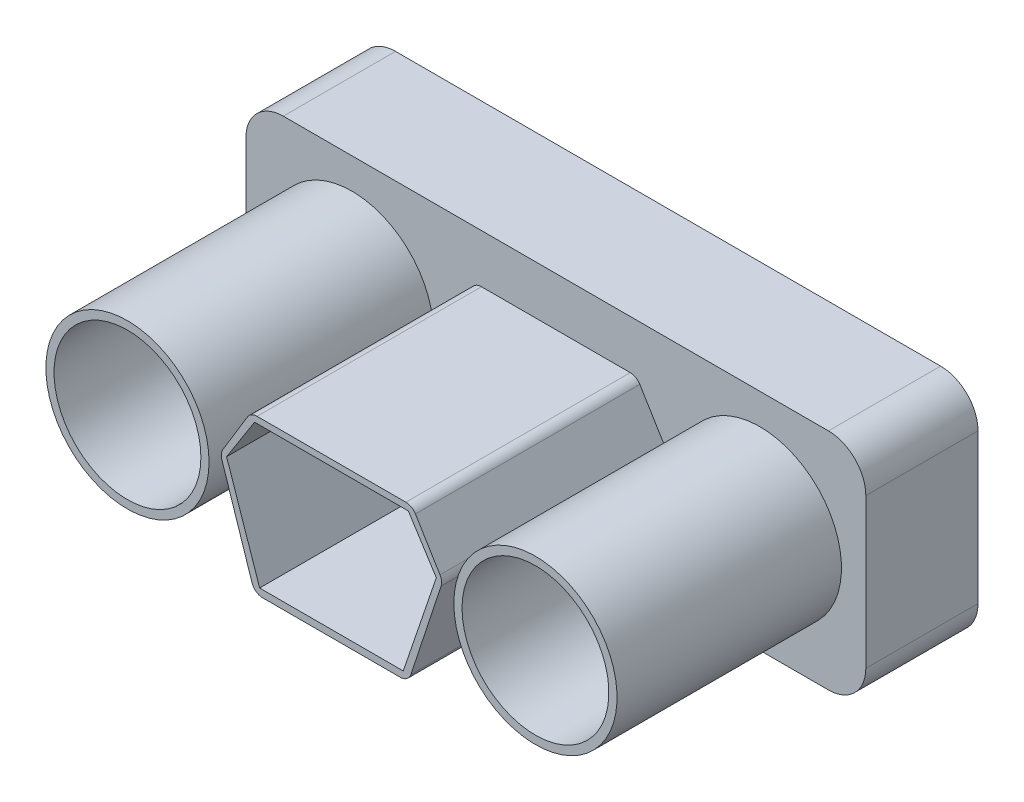
ISO-10303-21;
HEADER;
FILE_DESCRIPTION(('STEP AP214'),'2;1');
FILE_NAME('part.step','',(''),(''),'','','');
FILE_SCHEMA(('AUTOMOTIVE_DESIGN { 1 0 10303 214 1 1 1 1 }'));
ENDSEC;
DATA;
#1=APPLICATION_CONTEXT('core data for automotive mechanical design processes');
#2=APPLICATION_PROTOCOL_DEFINITION('international standard','automotive_design',2000,#1);
#3=PRODUCT_CONTEXT('',#1,'mechanical');
#4=PRODUCT('Part','Part','',(#3));
#5=PRODUCT_RELATED_PRODUCT_CATEGORY('part','',(#4));
#6=PRODUCT_DEFINITION_FORMATION('','',#4);
#7=PRODUCT_DEFINITION_CONTEXT('part definition',#1,'design');
#8=PRODUCT_DEFINITION('design','',#6,#7);
#9=PRODUCT_DEFINITION_SHAPE('','',#8);
#10=(LENGTH_UNIT() NAMED_UNIT(*) SI_UNIT(.MILLI.,.METRE.));
#11=(NAMED_UNIT(*) PLANE_ANGLE_UNIT() SI_UNIT($,.RADIAN.));
#12=(NAMED_UNIT(*) SI_UNIT($,.STERADIAN.) SOLID_ANGLE_UNIT());
#13=UNCERTAINTY_MEASURE_WITH_UNIT(LENGTH_MEASURE(1.E-05),#10,'distance_accuracy_value','');
#14=(GEOMETRIC_REPRESENTATION_CONTEXT(3) GLOBAL_UNCERTAINTY_ASSIGNED_CONTEXT((#13)) GLOBAL_UNIT_ASSIGNED_CONTEXT((#10,
#11,#12)) REPRESENTATION_CONTEXT('',''));
#15=CARTESIAN_POINT('',(0.,0.,0.));
#16=DIRECTION('',(0.,0.,1.));
#17=DIRECTION('',(1.,0.,0.));
#18=AXIS2_PLACEMENT_3D('',#15,#16,#17);
#19=CARTESIAN_POINT('',(0.,0.,3.));
#20=DIRECTION('',(0.,0.,1.));
#21=DIRECTION('',(1.,0.,0.));
#22=AXIS2_PLACEMENT_3D('',#19,#20,#21);
#23=PLANE('',#22);
#24=DIRECTION('',(1.,0.,0.));
#25=VECTOR('',#24,1.);
#26=CARTESIAN_POINT('',(-8.287121405,-3.,3.));
#27=LINE('',#26,#25);
#28=CARTESIAN_POINT('',(-7.287121405,-3.,3.));
#29=VERTEX_POINT('',#28);
#30=CARTESIAN_POINT('',(7.287121405,-3.,3.));
#31=VERTEX_POINT('',#30);
#32=EDGE_CURVE('E371',#29,#31,#27,.T.);
#33=ORIENTED_EDGE('',*,*,#32,.T.);
#34=CARTESIAN_POINT('',(7.287121405,-2.,3.));
#35=DIRECTION('',(0.,0.,1.));
#36=DIRECTION('',(1.,0.,0.));
#37=AXIS2_PLACEMENT_3D('',#34,#35,#36);
#38=CIRCLE('',#37,1.);
#39=CARTESIAN_POINT('',(8.287121405,-2.,3.));
#40=VERTEX_POINT('',#39);
#41=EDGE_CURVE('E432',#31,#40,#38,.T.);
#42=ORIENTED_EDGE('',*,*,#41,.T.);
#43=DIRECTION('',(0.,1.,0.));
#44=VECTOR('',#43,1.);
#45=CARTESIAN_POINT('',(8.287121405,3.,3.));
#46=LINE('',#45,#44);
#47=CARTESIAN_POINT('',(8.287121405,2.,3.));
#48=VERTEX_POINT('',#47);
#49=EDGE_CURVE('E358',#40,#48,#46,.T.);
#50=ORIENTED_EDGE('',*,*,#49,.T.);
#51=CARTESIAN_POINT('',(7.287121405,2.,3.));
#52=DIRECTION('',(0.,0.,1.));
#53=DIRECTION('',(1.,0.,0.));
#54=AXIS2_PLACEMENT_3D('',#51,#52,#53);
#55=CIRCLE('',#54,1.);
#56=CARTESIAN_POINT('',(7.287121405,3.,3.));
#57=VERTEX_POINT('',#56);
#58=EDGE_CURVE('E429',#48,#57,#55,.T.);
#59=ORIENTED_EDGE('',*,*,#58,.T.);
#60=DIRECTION('',(-1.,0.,0.));
#61=VECTOR('',#60,1.);
#62=CARTESIAN_POINT('',(-8.287121405,3.,3.));
#63=LINE('',#62,#61);
#64=CARTESIAN_POINT('',(-7.287121405,3.,3.));
#65=VERTEX_POINT('',#64);
#66=EDGE_CURVE('E362',#57,#65,#63,.T.);
#67=ORIENTED_EDGE('',*,*,#66,.T.);
#68=CARTESIAN_POINT('',(-7.287121405,2.,3.));
#69=DIRECTION('',(0.,0.,1.));
#70=DIRECTION('',(1.,0.,0.));
#71=AXIS2_PLACEMENT_3D('',#68,#69,#70);
#72=CIRCLE('',#71,1.);
#73=CARTESIAN_POINT('',(-8.287121405,2.,3.));
#74=VERTEX_POINT('',#73);
#75=EDGE_CURVE('E423',#65,#74,#72,.T.);
#76=ORIENTED_EDGE('',*,*,#75,.T.);
#77=DIRECTION('',(0.,-1.,0.));
#78=VECTOR('',#77,1.);
#79=CARTESIAN_POINT('',(-8.287121405,3.,3.));
#80=LINE('',#79,#78);
#81=CARTESIAN_POINT('',(-8.287121405,-2.,3.));
#82=VERTEX_POINT('',#81);
#83=EDGE_CURVE('E367',#74,#82,#80,.T.);
#84=ORIENTED_EDGE('',*,*,#83,.T.);
#85=CARTESIAN_POINT('',(-7.287121405,-2.,3.));
#86=DIRECTION('',(0.,0.,1.));
#87=DIRECTION('',(1.,0.,0.));
#88=AXIS2_PLACEMENT_3D('',#85,#86,#87);
#89=CIRCLE('',#88,1.);
#90=EDGE_CURVE('E426',#82,#29,#89,.T.);
#91=ORIENTED_EDGE('',*,*,#90,.T.);
#92=EDGE_LOOP('',(#33,#42,#50,#59,#67,#76,#84,#91));
#93=FACE_BOUND('',#92,.T.);
#94=CARTESIAN_POINT('',(-5.4542563943208,0.,3.));
#95=DIRECTION('',(0.,0.,1.));
#96=DIRECTION('',(1.,0.,0.));
#97=AXIS2_PLACEMENT_3D('',#94,#95,#96);
#98=CIRCLE('',#97,2.18179783482328);
#99=CARTESIAN_POINT('',(-3.27245855949752,0.,3.));
#100=VERTEX_POINT('',#99);
#101=EDGE_CURVE('E349',#100,#100,#98,.T.);
#102=ORIENTED_EDGE('',*,*,#101,.F.);
#103=EDGE_LOOP('',(#102));
#104=FACE_BOUND('',#103,.T.);
#105=CARTESIAN_POINT('',(5.4542563943208,0.,3.));
#106=DIRECTION('',(0.,0.,1.));
#107=DIRECTION('',(-1.,0.,0.));
#108=AXIS2_PLACEMENT_3D('',#105,#106,#107);
#109=CIRCLE('',#108,2.18179783482328);
#110=CARTESIAN_POINT('',(3.27245855949752,0.,3.));
#111=VERTEX_POINT('',#110);
#112=EDGE_CURVE('E337',#111,#111,#109,.T.);
#113=ORIENTED_EDGE('',*,*,#112,.F.);
#114=EDGE_LOOP('',(#113));
#115=FACE_BOUND('',#114,.T.);
#116=DIRECTION('',(0.312750637447262,-0.949835269284275,0.));
#117=VECTOR('',#116,1.);
#118=CARTESIAN_POINT('',(-2.05596580595893,-2.42977777067873,3.));
#119=LINE('',#118,#117);
#120=CARTESIAN_POINT('',(-2.93024258588437,0.225433190576301,3.));
#121=VERTEX_POINT('',#120);
#122=CARTESIAN_POINT('',(-2.12385263323548,-2.22360296191291,3.));
#123=VERTEX_POINT('',#122);
#124=EDGE_CURVE('E316',#121,#123,#119,.T.);
#125=ORIENTED_EDGE('',*,*,#124,.F.);
#126=CARTESIAN_POINT('',(-2.64529200509909,0.31925838181048,3.));
#127=DIRECTION('',(0.,0.,1.));
#128=DIRECTION('',(1.,0.,0.));
#129=AXIS2_PLACEMENT_3D('',#126,#127,#128);
#130=CIRCLE('',#129,0.3);
#131=CARTESIAN_POINT('',(-2.90167682777131,0.475036501915119,3.));
#132=VERTEX_POINT('',#131);
#133=EDGE_CURVE('E508',#121,#132,#130,.F.);
#134=ORIENTED_EDGE('',*,*,#133,.T.);
#135=DIRECTION('',(-0.519260400348797,-0.85461607557406,0.));
#136=VECTOR('',#135,1.);
#137=CARTESIAN_POINT('',(-2.97350426481664,0.356820511778007,3.));
#138=LINE('',#137,#136);
#139=CARTESIAN_POINT('',(-2.24554300759684,1.55492341428559,3.));
#140=VERTEX_POINT('',#139);
#141=EDGE_CURVE('E233',#140,#132,#138,.T.);
#142=ORIENTED_EDGE('',*,*,#141,.F.);
#143=CARTESIAN_POINT('',(-1.98915818492463,1.39914529418095,3.));
#144=DIRECTION('',(0.,0.,1.));
#145=DIRECTION('',(1.,0.,0.));
#146=AXIS2_PLACEMENT_3D('',#143,#144,#145);
#147=CIRCLE('',#146,0.3);
#148=CARTESIAN_POINT('',(-1.98915818492463,1.69914529418095,3.));
#149=VERTEX_POINT('',#148);
#150=EDGE_CURVE('E11',#140,#149,#147,.F.);
#151=ORIENTED_EDGE('',*,*,#150,.T.);
#152=DIRECTION('',(-1.,0.,0.));
#153=VECTOR('',#152,1.);
#154=CARTESIAN_POINT('',(2.15791452360979,1.69914529418095,3.));
#155=LINE('',#154,#153);
#156=CARTESIAN_POINT('',(1.98915818492463,1.69914529418095,3.));
#157=VERTEX_POINT('',#156);
#158=EDGE_CURVE('E292',#157,#149,#155,.T.);
#159=ORIENTED_EDGE('',*,*,#158,.F.);
#160=CARTESIAN_POINT('',(1.98915818492463,1.39914529418095,3.));
#161=DIRECTION('',(0.,0.,1.));
#162=DIRECTION('',(1.,0.,0.));
#163=AXIS2_PLACEMENT_3D('',#160,#161,#162);
#164=CIRCLE('',#163,0.3);
#165=CARTESIAN_POINT('',(2.24554300759684,1.55492341428559,3.));
#166=VERTEX_POINT('',#165);
#167=EDGE_CURVE('E47',#157,#166,#164,.F.);
#168=ORIENTED_EDGE('',*,*,#167,.T.);
#169=DIRECTION('',(-0.519260400348797,0.85461607557406,0.));
#170=VECTOR('',#169,1.);
#171=CARTESIAN_POINT('',(2.97350426481664,0.356820511778007,3.));
#172=LINE('',#171,#170);
#173=CARTESIAN_POINT('',(2.90167682777131,0.475036501915119,3.));
#174=VERTEX_POINT('',#173);
#175=EDGE_CURVE('E328',#174,#166,#172,.T.);
#176=ORIENTED_EDGE('',*,*,#175,.F.);
#177=CARTESIAN_POINT('',(2.64529200509909,0.31925838181048,3.));
#178=DIRECTION('',(0.,0.,1.));
#179=DIRECTION('',(1.,0.,0.));
#180=AXIS2_PLACEMENT_3D('',#177,#178,#179);
#181=CIRCLE('',#180,0.3);
#182=CARTESIAN_POINT('',(2.93024258588437,0.225433190576301,3.));
#183=VERTEX_POINT('',#182);
#184=EDGE_CURVE('E517',#174,#183,#181,.F.);
#185=ORIENTED_EDGE('',*,*,#184,.T.);
#186=DIRECTION('',(0.312750637447262,0.949835269284275,0.));
#187=VECTOR('',#186,1.);
#188=CARTESIAN_POINT('',(2.05596580595893,-2.42977777067873,3.));
#189=LINE('',#188,#187);
#190=CARTESIAN_POINT('',(2.12385263323548,-2.22360296191291,3.));
#191=VERTEX_POINT('',#190);
#192=EDGE_CURVE('E324',#191,#183,#189,.T.);
#193=ORIENTED_EDGE('',*,*,#192,.F.);
#194=CARTESIAN_POINT('',(1.8389020524502,-2.12977777067873,3.));
#195=DIRECTION('',(0.,0.,1.));
#196=DIRECTION('',(1.,0.,0.));
#197=AXIS2_PLACEMENT_3D('',#194,#195,#196);
#198=CIRCLE('',#197,0.3);
#199=CARTESIAN_POINT('',(1.8389020524502,-2.42977777067873,3.));
#200=VERTEX_POINT('',#199);
#201=EDGE_CURVE('E514',#191,#200,#198,.F.);
#202=ORIENTED_EDGE('',*,*,#201,.T.);
#203=DIRECTION('',(1.,0.,0.));
#204=VECTOR('',#203,1.);
#205=CARTESIAN_POINT('',(-2.05596580595893,-2.42977777067873,3.));
#206=LINE('',#205,#204);
#207=CARTESIAN_POINT('',(-1.8389020524502,-2.42977777067873,3.));
#208=VERTEX_POINT('',#207);
#209=EDGE_CURVE('E320',#208,#200,#206,.T.);
#210=ORIENTED_EDGE('',*,*,#209,.F.);
#211=CARTESIAN_POINT('',(-1.8389020524502,-2.12977777067873,3.));
#212=DIRECTION('',(0.,0.,1.));
#213=DIRECTION('',(1.,0.,0.));
#214=AXIS2_PLACEMENT_3D('',#211,#212,#213);
#215=CIRCLE('',#214,0.3);
#216=EDGE_CURVE('E511',#208,#123,#215,.F.);
#217=ORIENTED_EDGE('',*,*,#216,.T.);
#218=EDGE_LOOP('',(#125,#134,#142,#151,#159,#168,#176,#185,#193,#202,#210,#217));
#219=FACE_BOUND('',#218,.T.);
#220=ADVANCED_FACE('F38',(#93,#104,#115,#219),#23,.T.);
#221=CARTESIAN_POINT('',(8.287121405,3.,3.));
#222=DIRECTION('',(-1.,0.,0.));
#223=DIRECTION('',(0.,0.,1.));
#224=AXIS2_PLACEMENT_3D('',#221,#222,#223);
#225=PLANE('',#224);
#226=ORIENTED_EDGE('',*,*,#49,.F.);
#227=DIRECTION('',(0.,0.,-1.));
#228=VECTOR('',#227,1.);
#229=CARTESIAN_POINT('',(8.287121405,-2.,3.));
#230=LINE('',#229,#228);
#231=CARTESIAN_POINT('',(8.287121405,-2.,0.));
#232=VERTEX_POINT('',#231);
#233=EDGE_CURVE('E400',#40,#232,#230,.T.);
#234=ORIENTED_EDGE('',*,*,#233,.T.);
#235=DIRECTION('',(0.,1.,0.));
#236=VECTOR('',#235,1.);
#237=CARTESIAN_POINT('',(8.287121405,3.,0.));
#238=LINE('',#237,#236);
#239=CARTESIAN_POINT('',(8.287121405,2.,0.));
#240=VERTEX_POINT('',#239);
#241=EDGE_CURVE('E354',#232,#240,#238,.T.);
#242=ORIENTED_EDGE('',*,*,#241,.T.);
#243=DIRECTION('',(0.,0.,-1.));
#244=VECTOR('',#243,1.);
#245=CARTESIAN_POINT('',(8.287121405,2.,3.));
#246=LINE('',#245,#244);
#247=EDGE_CURVE('E397',#240,#48,#246,.F.);
#248=ORIENTED_EDGE('',*,*,#247,.T.);
#249=EDGE_LOOP('',(#226,#234,#242,#248));
#250=FACE_BOUND('',#249,.T.);
#251=ADVANCED_FACE('F577',(#250),#225,.F.);
#252=CARTESIAN_POINT('',(-8.287121405,3.,3.));
#253=DIRECTION('',(0.,-1.,0.));
#254=DIRECTION('',(0.,0.,-1.));
#255=AXIS2_PLACEMENT_3D('',#252,#253,#254);
#256=PLANE('',#255);
#257=ORIENTED_EDGE('',*,*,#66,.F.);
#258=DIRECTION('',(0.,0.,-1.));
#259=VECTOR('',#258,1.);
#260=CARTESIAN_POINT('',(7.287121405,3.,3.));
#261=LINE('',#260,#259);
#262=CARTESIAN_POINT('',(7.287121405,3.,0.));
#263=VERTEX_POINT('',#262);
#264=EDGE_CURVE('E438',#57,#263,#261,.T.);
#265=ORIENTED_EDGE('',*,*,#264,.T.);
#266=DIRECTION('',(-1.,0.,0.));
#267=VECTOR('',#266,1.);
#268=CARTESIAN_POINT('',(-8.287121405,3.,0.));
#269=LINE('',#268,#267);
#270=CARTESIAN_POINT('',(-7.287121405,3.,0.));
#271=VERTEX_POINT('',#270);
#272=EDGE_CURVE('E379',#263,#271,#269,.T.);
#273=ORIENTED_EDGE('',*,*,#272,.T.);
#274=DIRECTION('',(0.,0.,-1.));
#275=VECTOR('',#274,1.);
#276=CARTESIAN_POINT('',(-7.287121405,3.,3.));
#277=LINE('',#276,#275);
#278=EDGE_CURVE('E435',#271,#65,#277,.F.);
#279=ORIENTED_EDGE('',*,*,#278,.T.);
#280=EDGE_LOOP('',(#257,#265,#273,#279));
#281=FACE_BOUND('',#280,.T.);
#282=ADVANCED_FACE('F587',(#281),#256,.F.);
#283=CARTESIAN_POINT('',(-8.287121405,3.,3.));
#284=DIRECTION('',(1.,0.,0.));
#285=DIRECTION('',(0.,0.,-1.));
#286=AXIS2_PLACEMENT_3D('',#283,#284,#285);
#287=PLANE('',#286);
#288=DIRECTION('',(0.,-1.,0.));
#289=VECTOR('',#288,1.);
#290=CARTESIAN_POINT('',(-8.287121405,3.,0.));
#291=LINE('',#290,#289);
#292=CARTESIAN_POINT('',(-8.287121405,2.,0.));
#293=VERTEX_POINT('',#292);
#294=CARTESIAN_POINT('',(-8.287121405,-2.,0.));
#295=VERTEX_POINT('',#294);
#296=EDGE_CURVE('E383',#293,#295,#291,.T.);
#297=ORIENTED_EDGE('',*,*,#296,.T.);
#298=DIRECTION('',(0.,0.,-1.));
#299=VECTOR('',#298,1.);
#300=CARTESIAN_POINT('',(-8.287121405,-2.,3.));
#301=LINE('',#300,#299);
#302=EDGE_CURVE('E446',#295,#82,#301,.F.);
#303=ORIENTED_EDGE('',*,*,#302,.T.);
#304=ORIENTED_EDGE('',*,*,#83,.F.);
#305=DIRECTION('',(0.,0.,-1.));
#306=VECTOR('',#305,1.);
#307=CARTESIAN_POINT('',(-8.287121405,2.,3.));
#308=LINE('',#307,#306);
#309=EDGE_CURVE('E442',#74,#293,#308,.T.);
#310=ORIENTED_EDGE('',*,*,#309,.T.);
#311=EDGE_LOOP('',(#297,#303,#304,#310));
#312=FACE_BOUND('',#311,.T.);
#313=ADVANCED_FACE('F727',(#312),#287,.F.);
#314=CARTESIAN_POINT('',(-8.287121405,-3.,3.));
#315=DIRECTION('',(0.,1.,0.));
#316=DIRECTION('',(0.,0.,1.));
#317=AXIS2_PLACEMENT_3D('',#314,#315,#316);
#318=PLANE('',#317);
#319=DIRECTION('',(1.,0.,0.));
#320=VECTOR('',#319,1.);
#321=CARTESIAN_POINT('',(-8.287121405,-3.,0.));
#322=LINE('',#321,#320);
#323=CARTESIAN_POINT('',(-7.287121405,-3.,0.));
#324=VERTEX_POINT('',#323);
#325=CARTESIAN_POINT('',(7.287121405,-3.,0.));
#326=VERTEX_POINT('',#325);
#327=EDGE_CURVE('E363',#324,#326,#322,.T.);
#328=ORIENTED_EDGE('',*,*,#327,.T.);
#329=DIRECTION('',(0.,0.,-1.));
#330=VECTOR('',#329,1.);
#331=CARTESIAN_POINT('',(7.287121405,-3.,3.));
#332=LINE('',#331,#330);
#333=EDGE_CURVE('E420',#326,#31,#332,.F.);
#334=ORIENTED_EDGE('',*,*,#333,.T.);
#335=ORIENTED_EDGE('',*,*,#32,.F.);
#336=DIRECTION('',(0.,0.,-1.));
#337=VECTOR('',#336,1.);
#338=CARTESIAN_POINT('',(-7.287121405,-3.,3.));
#339=LINE('',#338,#337);
#340=EDGE_CURVE('E416',#29,#324,#339,.T.);
#341=ORIENTED_EDGE('',*,*,#340,.T.);
#342=EDGE_LOOP('',(#328,#334,#335,#341));
#343=FACE_BOUND('',#342,.T.);
#344=ADVANCED_FACE('F641',(#343),#318,.F.);
#345=CARTESIAN_POINT('',(0.,0.,0.));
#346=DIRECTION('',(0.,0.,1.));
#347=DIRECTION('',(1.,0.,0.));
#348=AXIS2_PLACEMENT_3D('',#345,#346,#347);
#349=PLANE('',#348);
#350=ORIENTED_EDGE('',*,*,#241,.F.);
#351=CARTESIAN_POINT('',(7.287121405,-2.,0.));
#352=DIRECTION('',(0.,0.,1.));
#353=DIRECTION('',(1.,0.,0.));
#354=AXIS2_PLACEMENT_3D('',#351,#352,#353);
#355=CIRCLE('',#354,1.);
#356=EDGE_CURVE('E413',#232,#326,#355,.F.);
#357=ORIENTED_EDGE('',*,*,#356,.T.);
#358=ORIENTED_EDGE('',*,*,#327,.F.);
#359=CARTESIAN_POINT('',(-7.287121405,-2.,0.));
#360=DIRECTION('',(0.,0.,1.));
#361=DIRECTION('',(1.,0.,0.));
#362=AXIS2_PLACEMENT_3D('',#359,#360,#361);
#363=CIRCLE('',#362,1.);
#364=EDGE_CURVE('E407',#324,#295,#363,.F.);
#365=ORIENTED_EDGE('',*,*,#364,.T.);
#366=ORIENTED_EDGE('',*,*,#296,.F.);
#367=CARTESIAN_POINT('',(-7.287121405,2.,0.));
#368=DIRECTION('',(0.,0.,1.));
#369=DIRECTION('',(1.,0.,0.));
#370=AXIS2_PLACEMENT_3D('',#367,#368,#369);
#371=CIRCLE('',#370,1.);
#372=EDGE_CURVE('E404',#293,#271,#371,.F.);
#373=ORIENTED_EDGE('',*,*,#372,.T.);
#374=ORIENTED_EDGE('',*,*,#272,.F.);
#375=CARTESIAN_POINT('',(7.287121405,2.,0.));
#376=DIRECTION('',(0.,0.,1.));
#377=DIRECTION('',(1.,0.,0.));
#378=AXIS2_PLACEMENT_3D('',#375,#376,#377);
#379=CIRCLE('',#378,1.);
#380=EDGE_CURVE('E410',#263,#240,#379,.F.);
#381=ORIENTED_EDGE('',*,*,#380,.T.);
#382=EDGE_LOOP('',(#350,#357,#358,#365,#366,#373,#374,#381));
#383=FACE_BOUND('',#382,.T.);
#384=ADVANCED_FACE('F635',(#383),#349,.F.);
#385=CARTESIAN_POINT('',(-5.4542563943208,0.,9.));
#386=DIRECTION('',(0.,0.,1.));
#387=DIRECTION('',(1.,0.,0.));
#388=AXIS2_PLACEMENT_3D('',#385,#386,#387);
#389=PLANE('',#388);
#390=CARTESIAN_POINT('',(-5.4542563943208,0.,9.));
#391=DIRECTION('',(0.,0.,1.));
#392=DIRECTION('',(1.,0.,0.));
#393=AXIS2_PLACEMENT_3D('',#390,#391,#392);
#394=CIRCLE('',#393,2.18179783482328);
#395=CARTESIAN_POINT('',(-3.27245855949752,0.,9.));
#396=VERTEX_POINT('',#395);
#397=EDGE_CURVE('E350',#396,#396,#394,.T.);
#398=ORIENTED_EDGE('',*,*,#397,.T.);
#399=EDGE_LOOP('',(#398));
#400=FACE_BOUND('',#399,.T.);
#401=CARTESIAN_POINT('',(-5.4542563943208,0.,9.));
#402=DIRECTION('',(0.,0.,1.));
#403=DIRECTION('',(1.,0.,0.));
#404=AXIS2_PLACEMENT_3D('',#401,#402,#403);
#405=CIRCLE('',#404,1.96346384073605);
#406=CARTESIAN_POINT('',(-3.49079255358475,0.,9.));
#407=VERTEX_POINT('',#406);
#408=EDGE_CURVE('E342',#407,#407,#405,.T.);
#409=ORIENTED_EDGE('',*,*,#408,.F.);
#410=EDGE_LOOP('',(#409));
#411=FACE_BOUND('',#410,.T.);
#412=ADVANCED_FACE('F630',(#400,#411),#389,.T.);
#413=CARTESIAN_POINT('',(-5.4542563943208,0.,9.));
#414=DIRECTION('',(0.,0.,-1.));
#415=DIRECTION('',(-1.,0.,0.));
#416=AXIS2_PLACEMENT_3D('',#413,#414,#415);
#417=CYLINDRICAL_SURFACE('',#416,2.18179783482328);
#418=ORIENTED_EDGE('',*,*,#397,.F.);
#419=EDGE_LOOP('',(#418));
#420=FACE_BOUND('',#419,.T.);
#421=ORIENTED_EDGE('',*,*,#101,.T.);
#422=EDGE_LOOP('',(#421));
#423=FACE_BOUND('',#422,.T.);
#424=ADVANCED_FACE('F622',(#420,#423),#417,.T.);
#425=CARTESIAN_POINT('',(-5.4542563943208,0.,9.));
#426=DIRECTION('',(0.,0.,-1.));
#427=DIRECTION('',(-1.,0.,0.));
#428=AXIS2_PLACEMENT_3D('',#425,#426,#427);
#429=CYLINDRICAL_SURFACE('',#428,1.96346384073605);
#430=ORIENTED_EDGE('',*,*,#408,.T.);
#431=EDGE_LOOP('',(#430));
#432=FACE_BOUND('',#431,.T.);
#433=CARTESIAN_POINT('',(-5.4542563943208,0.,3.));
#434=DIRECTION('',(0.,0.,1.));
#435=DIRECTION('',(1.,0.,0.));
#436=AXIS2_PLACEMENT_3D('',#433,#434,#435);
#437=CIRCLE('',#436,1.96346384073605);
#438=CARTESIAN_POINT('',(-3.49079255358475,0.,3.));
#439=VERTEX_POINT('',#438);
#440=EDGE_CURVE('E375',#439,#439,#437,.F.);
#441=ORIENTED_EDGE('',*,*,#440,.T.);
#442=EDGE_LOOP('',(#441));
#443=FACE_BOUND('',#442,.T.);
#444=ADVANCED_FACE('F613',(#432,#443),#429,.F.);
#445=ORIENTED_EDGE('',*,*,#440,.F.);
#446=EDGE_LOOP('',(#445));
#447=FACE_BOUND('',#446,.T.);
#448=ADVANCED_FACE('F596',(#447),#23,.T.);
#449=CARTESIAN_POINT('',(5.4542563943208,0.,9.));
#450=DIRECTION('',(0.,0.,-1.));
#451=DIRECTION('',(-1.,0.,0.));
#452=AXIS2_PLACEMENT_3D('',#449,#450,#451);
#453=PLANE('',#452);
#454=CARTESIAN_POINT('',(5.4542563943208,0.,9.));
#455=DIRECTION('',(0.,0.,1.));
#456=DIRECTION('',(-1.,0.,0.));
#457=AXIS2_PLACEMENT_3D('',#454,#455,#456);
#458=CIRCLE('',#457,2.18179783482328);
#459=CARTESIAN_POINT('',(3.27245855949752,0.,9.));
#460=VERTEX_POINT('',#459);
#461=EDGE_CURVE('E338',#460,#460,#458,.T.);
#462=ORIENTED_EDGE('',*,*,#461,.T.);
#463=EDGE_LOOP('',(#462));
#464=FACE_BOUND('',#463,.T.);
#465=CARTESIAN_POINT('',(5.4542563943208,0.,9.));
#466=DIRECTION('',(0.,0.,1.));
#467=DIRECTION('',(-1.,0.,0.));
#468=AXIS2_PLACEMENT_3D('',#465,#466,#467);
#469=CIRCLE('',#468,1.96346384073605);
#470=CARTESIAN_POINT('',(3.49079255358475,0.,9.));
#471=VERTEX_POINT('',#470);
#472=EDGE_CURVE('E312',#471,#471,#469,.T.);
#473=ORIENTED_EDGE('',*,*,#472,.F.);
#474=EDGE_LOOP('',(#473));
#475=FACE_BOUND('',#474,.T.);
#476=ADVANCED_FACE('F612',(#464,#475),#453,.F.);
#477=CARTESIAN_POINT('',(5.4542563943208,0.,9.));
#478=DIRECTION('',(0.,0.,-1.));
#479=DIRECTION('',(-1.,0.,0.));
#480=AXIS2_PLACEMENT_3D('',#477,#478,#479);
#481=CYLINDRICAL_SURFACE('',#480,2.18179783482328);
#482=ORIENTED_EDGE('',*,*,#461,.F.);
#483=EDGE_LOOP('',(#482));
#484=FACE_BOUND('',#483,.T.);
#485=ORIENTED_EDGE('',*,*,#112,.T.);
#486=EDGE_LOOP('',(#485));
#487=FACE_BOUND('',#486,.T.);
#488=ADVANCED_FACE('F619',(#484,#487),#481,.T.);
#489=CARTESIAN_POINT('',(5.4542563943208,0.,9.));
#490=DIRECTION('',(0.,0.,-1.));
#491=DIRECTION('',(-1.,0.,0.));
#492=AXIS2_PLACEMENT_3D('',#489,#490,#491);
#493=CYLINDRICAL_SURFACE('',#492,1.96346384073605);
#494=ORIENTED_EDGE('',*,*,#472,.T.);
#495=EDGE_LOOP('',(#494));
#496=FACE_BOUND('',#495,.T.);
#497=CARTESIAN_POINT('',(5.4542563943208,0.,3.));
#498=DIRECTION('',(0.,0.,1.));
#499=DIRECTION('',(1.,0.,0.));
#500=AXIS2_PLACEMENT_3D('',#497,#498,#499);
#501=CIRCLE('',#500,1.96346384073605);
#502=CARTESIAN_POINT('',(7.41772023505685,0.,3.));
#503=VERTEX_POINT('',#502);
#504=EDGE_CURVE('E393',#503,#503,#501,.F.);
#505=ORIENTED_EDGE('',*,*,#504,.T.);
#506=EDGE_LOOP('',(#505));
#507=FACE_BOUND('',#506,.T.);
#508=ADVANCED_FACE('F594',(#496,#507),#493,.F.);
#509=ORIENTED_EDGE('',*,*,#504,.F.);
#510=EDGE_LOOP('',(#509));
#511=FACE_BOUND('',#510,.T.);
#512=ADVANCED_FACE('F580',(#511),#23,.T.);
#513=CARTESIAN_POINT('',(0.,0.,9.));
#514=DIRECTION('',(0.,0.,1.));
#515=DIRECTION('',(1.,0.,0.));
#516=AXIS2_PLACEMENT_3D('',#513,#514,#515);
#517=PLANE('',#516);
#518=DIRECTION('',(-0.519260400348797,-0.85461607557406,0.));
#519=VECTOR('',#518,1.);
#520=CARTESIAN_POINT('',(-2.97350426481664,0.356820511778007,9.));
#521=LINE('',#520,#519);
#522=CARTESIAN_POINT('',(-2.24554300759684,1.55492341428559,9.));
#523=VERTEX_POINT('',#522);
#524=CARTESIAN_POINT('',(-2.90167682777131,0.475036501915119,9.));
#525=VERTEX_POINT('',#524);
#526=EDGE_CURVE('E287',#523,#525,#521,.T.);
#527=ORIENTED_EDGE('',*,*,#526,.T.);
#528=CARTESIAN_POINT('',(-2.64529200509909,0.31925838181048,9.));
#529=DIRECTION('',(0.,0.,1.));
#530=DIRECTION('',(1.,0.,0.));
#531=AXIS2_PLACEMENT_3D('',#528,#529,#530);
#532=CIRCLE('',#531,0.3);
#533=CARTESIAN_POINT('',(-2.93024258588437,0.225433190576301,9.));
#534=VERTEX_POINT('',#533);
#535=EDGE_CURVE('E478',#525,#534,#532,.T.);
#536=ORIENTED_EDGE('',*,*,#535,.T.);
#537=DIRECTION('',(0.312750637447262,-0.949835269284275,0.));
#538=VECTOR('',#537,1.);
#539=CARTESIAN_POINT('',(-2.05596580595893,-2.42977777067873,9.));
#540=LINE('',#539,#538);
#541=CARTESIAN_POINT('',(-2.12385263323548,-2.22360296191291,9.));
#542=VERTEX_POINT('',#541);
#543=EDGE_CURVE('E291',#534,#542,#540,.T.);
#544=ORIENTED_EDGE('',*,*,#543,.T.);
#545=CARTESIAN_POINT('',(-1.8389020524502,-2.12977777067873,9.));
#546=DIRECTION('',(0.,0.,1.));
#547=DIRECTION('',(1.,0.,0.));
#548=AXIS2_PLACEMENT_3D('',#545,#546,#547);
#549=CIRCLE('',#548,0.3);
#550=CARTESIAN_POINT('',(-1.8389020524502,-2.42977777067873,9.));
#551=VERTEX_POINT('',#550);
#552=EDGE_CURVE('E475',#542,#551,#549,.T.);
#553=ORIENTED_EDGE('',*,*,#552,.T.);
#554=DIRECTION('',(1.,0.,0.));
#555=VECTOR('',#554,1.);
#556=CARTESIAN_POINT('',(-2.05596580595893,-2.42977777067873,9.));
#557=LINE('',#556,#555);
#558=CARTESIAN_POINT('',(1.8389020524502,-2.42977777067873,9.));
#559=VERTEX_POINT('',#558);
#560=EDGE_CURVE('E296',#551,#559,#557,.T.);
#561=ORIENTED_EDGE('',*,*,#560,.T.);
#562=CARTESIAN_POINT('',(1.8389020524502,-2.12977777067873,9.));
#563=DIRECTION('',(0.,0.,1.));
#564=DIRECTION('',(1.,0.,0.));
#565=AXIS2_PLACEMENT_3D('',#562,#563,#564);
#566=CIRCLE('',#565,0.3);
#567=CARTESIAN_POINT('',(2.12385263323548,-2.22360296191291,9.));
#568=VERTEX_POINT('',#567);
#569=EDGE_CURVE('E472',#559,#568,#566,.T.);
#570=ORIENTED_EDGE('',*,*,#569,.T.);
#571=DIRECTION('',(0.312750637447262,0.949835269284275,0.));
#572=VECTOR('',#571,1.);
#573=CARTESIAN_POINT('',(2.05596580595893,-2.42977777067873,9.));
#574=LINE('',#573,#572);
#575=CARTESIAN_POINT('',(2.93024258588437,0.225433190576301,9.));
#576=VERTEX_POINT('',#575);
#577=EDGE_CURVE('E300',#568,#576,#574,.T.);
#578=ORIENTED_EDGE('',*,*,#577,.T.);
#579=CARTESIAN_POINT('',(2.64529200509909,0.31925838181048,9.));
#580=DIRECTION('',(0.,0.,1.));
#581=DIRECTION('',(1.,0.,0.));
#582=AXIS2_PLACEMENT_3D('',#579,#580,#581);
#583=CIRCLE('',#582,0.3);
#584=CARTESIAN_POINT('',(2.90167682777131,0.475036501915119,9.));
#585=VERTEX_POINT('',#584);
#586=EDGE_CURVE('E469',#576,#585,#583,.T.);
#587=ORIENTED_EDGE('',*,*,#586,.T.);
#588=DIRECTION('',(-0.519260400348797,0.85461607557406,0.));
#589=VECTOR('',#588,1.);
#590=CARTESIAN_POINT('',(2.97350426481664,0.356820511778007,9.));
#591=LINE('',#590,#589);
#592=CARTESIAN_POINT('',(2.24554300759684,1.55492341428559,9.));
#593=VERTEX_POINT('',#592);
#594=EDGE_CURVE('E304',#585,#593,#591,.T.);
#595=ORIENTED_EDGE('',*,*,#594,.T.);
#596=CARTESIAN_POINT('',(1.98915818492463,1.39914529418095,9.));
#597=DIRECTION('',(0.,0.,1.));
#598=DIRECTION('',(1.,0.,0.));
#599=AXIS2_PLACEMENT_3D('',#596,#597,#598);
#600=CIRCLE('',#599,0.3);
#601=CARTESIAN_POINT('',(1.98915818492463,1.69914529418095,9.));
#602=VERTEX_POINT('',#601);
#603=EDGE_CURVE('E466',#593,#602,#600,.T.);
#604=ORIENTED_EDGE('',*,*,#603,.T.);
#605=DIRECTION('',(-1.,0.,0.));
#606=VECTOR('',#605,1.);
#607=CARTESIAN_POINT('',(2.15791452360979,1.69914529418095,9.));
#608=LINE('',#607,#606);
#609=CARTESIAN_POINT('',(-1.98915818492463,1.69914529418095,9.));
#610=VERTEX_POINT('',#609);
#611=EDGE_CURVE('E308',#602,#610,#608,.T.);
#612=ORIENTED_EDGE('',*,*,#611,.T.);
#613=CARTESIAN_POINT('',(-1.98915818492463,1.39914529418095,9.));
#614=DIRECTION('',(0.,0.,1.));
#615=DIRECTION('',(1.,0.,0.));
#616=AXIS2_PLACEMENT_3D('',#613,#614,#615);
#617=CIRCLE('',#616,0.3);
#618=EDGE_CURVE('E463',#610,#523,#617,.T.);
#619=ORIENTED_EDGE('',*,*,#618,.T.);
#620=EDGE_LOOP('',(#527,#536,#544,#553,#561,#570,#578,#587,#595,#604,#612,#619));
#621=FACE_BOUND('',#620,.T.);
#622=DIRECTION('',(0.321791789765732,-0.946810458349171,0.));
#623=VECTOR('',#622,1.);
#624=CARTESIAN_POINT('',(-1.92003418242446,-2.24287178831883,9.));
#625=LINE('',#624,#623);
#626=CARTESIAN_POINT('',(-2.80358973539855,0.356820511778007,9.));
#627=VERTEX_POINT('',#626);
#628=CARTESIAN_POINT('',(-1.92003418242446,-2.24287178831883,9.));
#629=VERTEX_POINT('',#628);
#630=EDGE_CURVE('E223',#627,#629,#625,.T.);
#631=ORIENTED_EDGE('',*,*,#630,.F.);
#632=DIRECTION('',(-0.537665941617353,-0.843157953899935,0.));
#633=VECTOR('',#632,1.);
#634=CARTESIAN_POINT('',(-2.80358973539855,0.356820511778007,9.));
#635=LINE('',#634,#633);
#636=CARTESIAN_POINT('',(-2.05596580595893,1.52923076476285,9.));
#637=VERTEX_POINT('',#636);
#638=EDGE_CURVE('E212',#637,#627,#635,.T.);
#639=ORIENTED_EDGE('',*,*,#638,.F.);
#640=DIRECTION('',(-1.,0.,0.));
#641=VECTOR('',#640,1.);
#642=CARTESIAN_POINT('',(2.05596580595893,1.52923076476285,9.));
#643=LINE('',#642,#641);
#644=CARTESIAN_POINT('',(2.05596580595893,1.52923076476285,9.));
#645=VERTEX_POINT('',#644);
#646=EDGE_CURVE('E252',#645,#637,#643,.T.);
#647=ORIENTED_EDGE('',*,*,#646,.F.);
#648=DIRECTION('',(-0.537665941617353,0.843157953899935,0.));
#649=VECTOR('',#648,1.);
#650=CARTESIAN_POINT('',(2.80358973539855,0.356820511778007,9.));
#651=LINE('',#650,#649);
#652=CARTESIAN_POINT('',(2.80358973539855,0.356820511778007,9.));
#653=VERTEX_POINT('',#652);
#654=EDGE_CURVE('E248',#653,#645,#651,.T.);
#655=ORIENTED_EDGE('',*,*,#654,.F.);
#656=DIRECTION('',(0.321791789765732,0.946810458349171,0.));
#657=VECTOR('',#656,1.);
#658=CARTESIAN_POINT('',(1.92003418242446,-2.24287178831883,9.));
#659=LINE('',#658,#657);
#660=CARTESIAN_POINT('',(1.92003418242446,-2.24287178831883,9.));
#661=VERTEX_POINT('',#660);
#662=EDGE_CURVE('E243',#661,#653,#659,.T.);
#663=ORIENTED_EDGE('',*,*,#662,.F.);
#664=DIRECTION('',(1.,0.,0.));
#665=VECTOR('',#664,1.);
#666=CARTESIAN_POINT('',(-1.92003418242446,-2.24287178831883,9.));
#667=LINE('',#666,#665);
#668=EDGE_CURVE('E239',#629,#661,#667,.T.);
#669=ORIENTED_EDGE('',*,*,#668,.F.);
#670=EDGE_LOOP('',(#631,#639,#647,#655,#663,#669));
#671=FACE_BOUND('',#670,.T.);
#672=ADVANCED_FACE('F237',(#621,#671),#517,.T.);
#673=CARTESIAN_POINT('',(-2.97350426481664,0.356820511778007,9.));
#674=DIRECTION('',(0.85461607557406,-0.519260400348797,0.));
#675=DIRECTION('',(0.519260400348797,0.85461607557406,0.));
#676=AXIS2_PLACEMENT_3D('',#673,#674,#675);
#677=PLANE('',#676);
#678=ORIENTED_EDGE('',*,*,#141,.T.);
#679=DIRECTION('',(0.,0.,-1.));
#680=VECTOR('',#679,1.);
#681=CARTESIAN_POINT('',(-2.90167682777131,0.475036501915119,9.));
#682=LINE('',#681,#680);
#683=EDGE_CURVE('E460',#132,#525,#682,.F.);
#684=ORIENTED_EDGE('',*,*,#683,.T.);
#685=ORIENTED_EDGE('',*,*,#526,.F.);
#686=DIRECTION('',(0.,0.,-1.));
#687=VECTOR('',#686,1.);
#688=CARTESIAN_POINT('',(-2.24554300759684,1.55492341428559,9.));
#689=LINE('',#688,#687);
#690=EDGE_CURVE('E456',#523,#140,#689,.T.);
#691=ORIENTED_EDGE('',*,*,#690,.T.);
#692=EDGE_LOOP('',(#678,#684,#685,#691));
#693=FACE_BOUND('',#692,.T.);
#694=ADVANCED_FACE('F539',(#693),#677,.F.);
#695=CARTESIAN_POINT('',(-2.05596580595893,-2.42977777067873,9.));
#696=DIRECTION('',(0.949835269284275,0.312750637447262,0.));
#697=DIRECTION('',(-0.312750637447262,0.949835269284275,0.));
#698=AXIS2_PLACEMENT_3D('',#695,#696,#697);
#699=PLANE('',#698);
#700=ORIENTED_EDGE('',*,*,#543,.F.);
#701=DIRECTION('',(0.,0.,-1.));
#702=VECTOR('',#701,1.);
#703=CARTESIAN_POINT('',(-2.93024258588437,0.225433190576301,9.));
#704=LINE('',#703,#702);
#705=EDGE_CURVE('E452',#534,#121,#704,.T.);
#706=ORIENTED_EDGE('',*,*,#705,.T.);
#707=ORIENTED_EDGE('',*,*,#124,.T.);
#708=DIRECTION('',(0.,0.,-1.));
#709=VECTOR('',#708,1.);
#710=CARTESIAN_POINT('',(-2.12385263323548,-2.22360296191291,9.));
#711=LINE('',#710,#709);
#712=EDGE_CURVE('E449',#123,#542,#711,.F.);
#713=ORIENTED_EDGE('',*,*,#712,.T.);
#714=EDGE_LOOP('',(#700,#706,#707,#713));
#715=FACE_BOUND('',#714,.T.);
#716=ADVANCED_FACE('F547',(#715),#699,.F.);
#717=CARTESIAN_POINT('',(-2.05596580595893,-2.42977777067873,9.));
#718=DIRECTION('',(0.,1.,0.));
#719=DIRECTION('',(0.,0.,1.));
#720=AXIS2_PLACEMENT_3D('',#717,#718,#719);
#721=PLANE('',#720);
#722=ORIENTED_EDGE('',*,*,#560,.F.);
#723=DIRECTION('',(0.,0.,-1.));
#724=VECTOR('',#723,1.);
#725=CARTESIAN_POINT('',(-1.8389020524502,-2.42977777067873,9.));
#726=LINE('',#725,#724);
#727=EDGE_CURVE('E484',#551,#208,#726,.T.);
#728=ORIENTED_EDGE('',*,*,#727,.T.);
#729=ORIENTED_EDGE('',*,*,#209,.T.);
#730=DIRECTION('',(0.,0.,-1.));
#731=VECTOR('',#730,1.);
#732=CARTESIAN_POINT('',(1.8389020524502,-2.42977777067873,9.));
#733=LINE('',#732,#731);
#734=EDGE_CURVE('E481',#200,#559,#733,.F.);
#735=ORIENTED_EDGE('',*,*,#734,.T.);
#736=EDGE_LOOP('',(#722,#728,#729,#735));
#737=FACE_BOUND('',#736,.T.);
#738=ADVANCED_FACE('F555',(#737),#721,.F.);
#739=CARTESIAN_POINT('',(2.05596580595893,-2.42977777067873,9.));
#740=DIRECTION('',(-0.949835269284275,0.312750637447262,0.));
#741=DIRECTION('',(-0.312750637447262,-0.949835269284275,0.));
#742=AXIS2_PLACEMENT_3D('',#739,#740,#741);
#743=PLANE('',#742);
#744=ORIENTED_EDGE('',*,*,#577,.F.);
#745=DIRECTION('',(0.,0.,-1.));
#746=VECTOR('',#745,1.);
#747=CARTESIAN_POINT('',(2.12385263323548,-2.22360296191291,9.));
#748=LINE('',#747,#746);
#749=EDGE_CURVE('E491',#568,#191,#748,.T.);
#750=ORIENTED_EDGE('',*,*,#749,.T.);
#751=ORIENTED_EDGE('',*,*,#192,.T.);
#752=DIRECTION('',(0.,0.,-1.));
#753=VECTOR('',#752,1.);
#754=CARTESIAN_POINT('',(2.93024258588437,0.225433190576301,9.));
#755=LINE('',#754,#753);
#756=EDGE_CURVE('E488',#183,#576,#755,.F.);
#757=ORIENTED_EDGE('',*,*,#756,.T.);
#758=EDGE_LOOP('',(#744,#750,#751,#757));
#759=FACE_BOUND('',#758,.T.);
#760=ADVANCED_FACE('F564',(#759),#743,.F.);
#761=CARTESIAN_POINT('',(2.97350426481664,0.356820511778007,9.));
#762=DIRECTION('',(-0.85461607557406,-0.519260400348797,0.));
#763=DIRECTION('',(0.519260400348797,-0.85461607557406,0.));
#764=AXIS2_PLACEMENT_3D('',#761,#762,#763);
#765=PLANE('',#764);
#766=ORIENTED_EDGE('',*,*,#594,.F.);
#767=DIRECTION('',(0.,0.,-1.));
#768=VECTOR('',#767,1.);
#769=CARTESIAN_POINT('',(2.90167682777131,0.475036501915119,9.));
#770=LINE('',#769,#768);
#771=EDGE_CURVE('E498',#585,#174,#770,.T.);
#772=ORIENTED_EDGE('',*,*,#771,.T.);
#773=ORIENTED_EDGE('',*,*,#175,.T.);
#774=DIRECTION('',(0.,0.,-1.));
#775=VECTOR('',#774,1.);
#776=CARTESIAN_POINT('',(2.24554300759684,1.55492341428559,9.));
#777=LINE('',#776,#775);
#778=EDGE_CURVE('E495',#166,#593,#777,.F.);
#779=ORIENTED_EDGE('',*,*,#778,.T.);
#780=EDGE_LOOP('',(#766,#772,#773,#779));
#781=FACE_BOUND('',#780,.T.);
#782=ADVANCED_FACE('F524',(#781),#765,.F.);
#783=CARTESIAN_POINT('',(2.15791452360979,1.69914529418095,9.));
#784=DIRECTION('',(0.,-1.,0.));
#785=DIRECTION('',(0.,0.,-1.));
#786=AXIS2_PLACEMENT_3D('',#783,#784,#785);
#787=PLANE('',#786);
#788=ORIENTED_EDGE('',*,*,#611,.F.);
#789=DIRECTION('',(0.,0.,-1.));
#790=VECTOR('',#789,1.);
#791=CARTESIAN_POINT('',(1.98915818492463,1.69914529418095,9.));
#792=LINE('',#791,#790);
#793=EDGE_CURVE('E505',#602,#157,#792,.T.);
#794=ORIENTED_EDGE('',*,*,#793,.T.);
#795=ORIENTED_EDGE('',*,*,#158,.T.);
#796=DIRECTION('',(0.,0.,-1.));
#797=VECTOR('',#796,1.);
#798=CARTESIAN_POINT('',(-1.98915818492463,1.69914529418095,9.));
#799=LINE('',#798,#797);
#800=EDGE_CURVE('E502',#149,#610,#799,.F.);
#801=ORIENTED_EDGE('',*,*,#800,.T.);
#802=EDGE_LOOP('',(#788,#794,#795,#801));
#803=FACE_BOUND('',#802,.T.);
#804=ADVANCED_FACE('F532',(#803),#787,.F.);
#805=CARTESIAN_POINT('',(-2.80358973539855,0.356820511778007,9.));
#806=DIRECTION('',(0.843157953899935,-0.537665941617352,0.));
#807=DIRECTION('',(0.537665941617353,0.843157953899936,0.));
#808=AXIS2_PLACEMENT_3D('',#805,#806,#807);
#809=PLANE('',#808);
#810=DIRECTION('',(-0.537665941617353,-0.843157953899935,0.));
#811=VECTOR('',#810,1.);
#812=CARTESIAN_POINT('',(-2.80358973539855,0.356820511778007,3.));
#813=LINE('',#812,#811);
#814=CARTESIAN_POINT('',(-2.05596580595893,1.52923076476285,3.));
#815=VERTEX_POINT('',#814);
#816=CARTESIAN_POINT('',(-2.80358973539855,0.356820511778007,3.));
#817=VERTEX_POINT('',#816);
#818=EDGE_CURVE('E255',#815,#817,#813,.T.);
#819=ORIENTED_EDGE('',*,*,#818,.F.);
#820=DIRECTION('',(0.,0.,-1.));
#821=VECTOR('',#820,1.);
#822=CARTESIAN_POINT('',(-2.05596580595893,1.52923076476285,9.));
#823=LINE('',#822,#821);
#824=EDGE_CURVE('E218',#637,#815,#823,.T.);
#825=ORIENTED_EDGE('',*,*,#824,.F.);
#826=ORIENTED_EDGE('',*,*,#638,.T.);
#827=DIRECTION('',(0.,0.,-1.));
#828=VECTOR('',#827,1.);
#829=CARTESIAN_POINT('',(-2.80358973539855,0.356820511778007,9.));
#830=LINE('',#829,#828);
#831=EDGE_CURVE('E216',#627,#817,#830,.T.);
#832=ORIENTED_EDGE('',*,*,#831,.T.);
#833=EDGE_LOOP('',(#819,#825,#826,#832));
#834=FACE_BOUND('',#833,.T.);
#835=ADVANCED_FACE('F215',(#834),#809,.T.);
#836=CARTESIAN_POINT('',(-1.92003418242446,-2.24287178831883,9.));
#837=DIRECTION('',(0.946810458349171,0.321791789765732,0.));
#838=DIRECTION('',(-0.321791789765732,0.946810458349171,0.));
#839=AXIS2_PLACEMENT_3D('',#836,#837,#838);
#840=PLANE('',#839);
#841=DIRECTION('',(0.321791789765732,-0.946810458349171,0.));
#842=VECTOR('',#841,1.);
#843=CARTESIAN_POINT('',(-1.92003418242446,-2.24287178831883,3.));
#844=LINE('',#843,#842);
#845=CARTESIAN_POINT('',(-1.92003418242446,-2.24287178831883,3.));
#846=VERTEX_POINT('',#845);
#847=EDGE_CURVE('E231',#817,#846,#844,.T.);
#848=ORIENTED_EDGE('',*,*,#847,.F.);
#849=ORIENTED_EDGE('',*,*,#831,.F.);
#850=ORIENTED_EDGE('',*,*,#630,.T.);
#851=DIRECTION('',(0.,0.,-1.));
#852=VECTOR('',#851,1.);
#853=CARTESIAN_POINT('',(-1.92003418242446,-2.24287178831883,9.));
#854=LINE('',#853,#852);
#855=EDGE_CURVE('E234',#629,#846,#854,.T.);
#856=ORIENTED_EDGE('',*,*,#855,.T.);
#857=EDGE_LOOP('',(#848,#849,#850,#856));
#858=FACE_BOUND('',#857,.T.);
#859=ADVANCED_FACE('F228',(#858),#840,.T.);
#860=CARTESIAN_POINT('',(-1.92003418242446,-2.24287178831883,9.));
#861=DIRECTION('',(0.,1.,0.));
#862=DIRECTION('',(0.,0.,1.));
#863=AXIS2_PLACEMENT_3D('',#860,#861,#862);
#864=PLANE('',#863);
#865=DIRECTION('',(1.,0.,0.));
#866=VECTOR('',#865,1.);
#867=CARTESIAN_POINT('',(-1.92003418242446,-2.24287178831883,3.));
#868=LINE('',#867,#866);
#869=CARTESIAN_POINT('',(1.92003418242446,-2.24287178831883,3.));
#870=VERTEX_POINT('',#869);
#871=EDGE_CURVE('E260',#846,#870,#868,.T.);
#872=ORIENTED_EDGE('',*,*,#871,.F.);
#873=ORIENTED_EDGE('',*,*,#855,.F.);
#874=ORIENTED_EDGE('',*,*,#668,.T.);
#875=DIRECTION('',(0.,0.,-1.));
#876=VECTOR('',#875,1.);
#877=CARTESIAN_POINT('',(1.92003418242446,-2.24287178831883,9.));
#878=LINE('',#877,#876);
#879=EDGE_CURVE('E281',#661,#870,#878,.T.);
#880=ORIENTED_EDGE('',*,*,#879,.T.);
#881=EDGE_LOOP('',(#872,#873,#874,#880));
#882=FACE_BOUND('',#881,.T.);
#883=ADVANCED_FACE('F683',(#882),#864,.T.);
#884=CARTESIAN_POINT('',(1.92003418242446,-2.24287178831883,9.));
#885=DIRECTION('',(-0.946810458349171,0.321791789765732,0.));
#886=DIRECTION('',(-0.321791789765732,-0.946810458349171,0.));
#887=AXIS2_PLACEMENT_3D('',#884,#885,#886);
#888=PLANE('',#887);
#889=DIRECTION('',(0.321791789765732,0.946810458349171,0.));
#890=VECTOR('',#889,1.);
#891=CARTESIAN_POINT('',(1.92003418242446,-2.24287178831883,3.));
#892=LINE('',#891,#890);
#893=CARTESIAN_POINT('',(2.80358973539855,0.356820511778007,3.));
#894=VERTEX_POINT('',#893);
#895=EDGE_CURVE('E263',#870,#894,#892,.T.);
#896=ORIENTED_EDGE('',*,*,#895,.F.);
#897=ORIENTED_EDGE('',*,*,#879,.F.);
#898=ORIENTED_EDGE('',*,*,#662,.T.);
#899=DIRECTION('',(0.,0.,-1.));
#900=VECTOR('',#899,1.);
#901=CARTESIAN_POINT('',(2.80358973539855,0.356820511778007,9.));
#902=LINE('',#901,#900);
#903=EDGE_CURVE('E277',#653,#894,#902,.T.);
#904=ORIENTED_EDGE('',*,*,#903,.T.);
#905=EDGE_LOOP('',(#896,#897,#898,#904));
#906=FACE_BOUND('',#905,.T.);
#907=ADVANCED_FACE('F686',(#906),#888,.T.);
#908=CARTESIAN_POINT('',(2.80358973539855,0.356820511778007,9.));
#909=DIRECTION('',(-0.843157953899935,-0.537665941617352,0.));
#910=DIRECTION('',(0.537665941617353,-0.843157953899936,0.));
#911=AXIS2_PLACEMENT_3D('',#908,#909,#910);
#912=PLANE('',#911);
#913=DIRECTION('',(-0.537665941617353,0.843157953899935,0.));
#914=VECTOR('',#913,1.);
#915=CARTESIAN_POINT('',(2.80358973539855,0.356820511778007,3.));
#916=LINE('',#915,#914);
#917=CARTESIAN_POINT('',(2.05596580595893,1.52923076476285,3.));
#918=VERTEX_POINT('',#917);
#919=EDGE_CURVE('E266',#894,#918,#916,.T.);
#920=ORIENTED_EDGE('',*,*,#919,.F.);
#921=ORIENTED_EDGE('',*,*,#903,.F.);
#922=ORIENTED_EDGE('',*,*,#654,.T.);
#923=DIRECTION('',(0.,0.,-1.));
#924=VECTOR('',#923,1.);
#925=CARTESIAN_POINT('',(2.05596580595893,1.52923076476285,9.));
#926=LINE('',#925,#924);
#927=EDGE_CURVE('E273',#645,#918,#926,.T.);
#928=ORIENTED_EDGE('',*,*,#927,.T.);
#929=EDGE_LOOP('',(#920,#921,#922,#928));
#930=FACE_BOUND('',#929,.T.);
#931=ADVANCED_FACE('F608',(#930),#912,.T.);
#932=CARTESIAN_POINT('',(2.05596580595893,1.52923076476285,9.));
#933=DIRECTION('',(0.,-1.,0.));
#934=DIRECTION('',(0.,0.,-1.));
#935=AXIS2_PLACEMENT_3D('',#932,#933,#934);
#936=PLANE('',#935);
#937=DIRECTION('',(-1.,0.,0.));
#938=VECTOR('',#937,1.);
#939=CARTESIAN_POINT('',(2.05596580595893,1.52923076476285,3.));
#940=LINE('',#939,#938);
#941=EDGE_CURVE('E224',#918,#815,#940,.T.);
#942=ORIENTED_EDGE('',*,*,#941,.F.);
#943=ORIENTED_EDGE('',*,*,#927,.F.);
#944=ORIENTED_EDGE('',*,*,#646,.T.);
#945=ORIENTED_EDGE('',*,*,#824,.T.);
#946=EDGE_LOOP('',(#942,#943,#944,#945));
#947=FACE_BOUND('',#946,.T.);
#948=ADVANCED_FACE('F599',(#947),#936,.T.);
#949=ORIENTED_EDGE('',*,*,#818,.T.);
#950=ORIENTED_EDGE('',*,*,#847,.T.);
#951=ORIENTED_EDGE('',*,*,#871,.T.);
#952=ORIENTED_EDGE('',*,*,#895,.T.);
#953=ORIENTED_EDGE('',*,*,#919,.T.);
#954=ORIENTED_EDGE('',*,*,#941,.T.);
#955=EDGE_LOOP('',(#949,#950,#951,#952,#953,#954));
#956=FACE_BOUND('',#955,.T.);
#957=ADVANCED_FACE('F581',(#956),#23,.T.);
#958=CARTESIAN_POINT('',(7.287121405,-2.,3.));
#959=DIRECTION('',(0.,0.,-1.));
#960=DIRECTION('',(-1.,0.,0.));
#961=AXIS2_PLACEMENT_3D('',#958,#959,#960);
#962=CYLINDRICAL_SURFACE('',#961,1.);
#963=ORIENTED_EDGE('',*,*,#41,.F.);
#964=ORIENTED_EDGE('',*,*,#333,.F.);
#965=ORIENTED_EDGE('',*,*,#356,.F.);
#966=ORIENTED_EDGE('',*,*,#233,.F.);
#967=EDGE_LOOP('',(#963,#964,#965,#966));
#968=FACE_BOUND('',#967,.T.);
#969=ADVANCED_FACE('F598',(#968),#962,.T.);
#970=CARTESIAN_POINT('',(7.287121405,2.,3.));
#971=DIRECTION('',(0.,0.,-1.));
#972=DIRECTION('',(-1.,0.,0.));
#973=AXIS2_PLACEMENT_3D('',#970,#971,#972);
#974=CYLINDRICAL_SURFACE('',#973,1.);
#975=ORIENTED_EDGE('',*,*,#58,.F.);
#976=ORIENTED_EDGE('',*,*,#247,.F.);
#977=ORIENTED_EDGE('',*,*,#380,.F.);
#978=ORIENTED_EDGE('',*,*,#264,.F.);
#979=EDGE_LOOP('',(#975,#976,#977,#978));
#980=FACE_BOUND('',#979,.T.);
#981=ADVANCED_FACE('F605',(#980),#974,.T.);
#982=CARTESIAN_POINT('',(-7.287121405,-2.,3.));
#983=DIRECTION('',(0.,0.,-1.));
#984=DIRECTION('',(-1.,0.,0.));
#985=AXIS2_PLACEMENT_3D('',#982,#983,#984);
#986=CYLINDRICAL_SURFACE('',#985,1.);
#987=ORIENTED_EDGE('',*,*,#90,.F.);
#988=ORIENTED_EDGE('',*,*,#302,.F.);
#989=ORIENTED_EDGE('',*,*,#364,.F.);
#990=ORIENTED_EDGE('',*,*,#340,.F.);
#991=EDGE_LOOP('',(#987,#988,#989,#990));
#992=FACE_BOUND('',#991,.T.);
#993=ADVANCED_FACE('F756',(#992),#986,.T.);
#994=CARTESIAN_POINT('',(-7.287121405,2.,3.));
#995=DIRECTION('',(0.,0.,-1.));
#996=DIRECTION('',(-1.,0.,0.));
#997=AXIS2_PLACEMENT_3D('',#994,#995,#996);
#998=CYLINDRICAL_SURFACE('',#997,1.);
#999=ORIENTED_EDGE('',*,*,#75,.F.);
#1000=ORIENTED_EDGE('',*,*,#278,.F.);
#1001=ORIENTED_EDGE('',*,*,#372,.F.);
#1002=ORIENTED_EDGE('',*,*,#309,.F.);
#1003=EDGE_LOOP('',(#999,#1000,#1001,#1002));
#1004=FACE_BOUND('',#1003,.T.);
#1005=ADVANCED_FACE('F765',(#1004),#998,.T.);
#1006=CARTESIAN_POINT('',(-2.64529200509909,0.31925838181048,9.));
#1007=DIRECTION('',(0.,0.,-1.));
#1008=DIRECTION('',(-1.,0.,0.));
#1009=AXIS2_PLACEMENT_3D('',#1006,#1007,#1008);
#1010=CYLINDRICAL_SURFACE('',#1009,0.3);
#1011=ORIENTED_EDGE('',*,*,#535,.F.);
#1012=ORIENTED_EDGE('',*,*,#683,.F.);
#1013=ORIENTED_EDGE('',*,*,#133,.F.);
#1014=ORIENTED_EDGE('',*,*,#705,.F.);
#1015=EDGE_LOOP('',(#1011,#1012,#1013,#1014));
#1016=FACE_BOUND('',#1015,.T.);
#1017=ADVANCED_FACE('F542',(#1016),#1010,.T.);
#1018=CARTESIAN_POINT('',(-1.8389020524502,-2.12977777067873,9.));
#1019=DIRECTION('',(0.,0.,-1.));
#1020=DIRECTION('',(-1.,0.,0.));
#1021=AXIS2_PLACEMENT_3D('',#1018,#1019,#1020);
#1022=CYLINDRICAL_SURFACE('',#1021,0.3);
#1023=ORIENTED_EDGE('',*,*,#552,.F.);
#1024=ORIENTED_EDGE('',*,*,#712,.F.);
#1025=ORIENTED_EDGE('',*,*,#216,.F.);
#1026=ORIENTED_EDGE('',*,*,#727,.F.);
#1027=EDGE_LOOP('',(#1023,#1024,#1025,#1026));
#1028=FACE_BOUND('',#1027,.T.);
#1029=ADVANCED_FACE('F550',(#1028),#1022,.T.);
#1030=CARTESIAN_POINT('',(1.8389020524502,-2.12977777067873,9.));
#1031=DIRECTION('',(0.,0.,-1.));
#1032=DIRECTION('',(-1.,0.,0.));
#1033=AXIS2_PLACEMENT_3D('',#1030,#1031,#1032);
#1034=CYLINDRICAL_SURFACE('',#1033,0.3);
#1035=ORIENTED_EDGE('',*,*,#569,.F.);
#1036=ORIENTED_EDGE('',*,*,#734,.F.);
#1037=ORIENTED_EDGE('',*,*,#201,.F.);
#1038=ORIENTED_EDGE('',*,*,#749,.F.);
#1039=EDGE_LOOP('',(#1035,#1036,#1037,#1038));
#1040=FACE_BOUND('',#1039,.T.);
#1041=ADVANCED_FACE('F559',(#1040),#1034,.T.);
#1042=CARTESIAN_POINT('',(2.64529200509909,0.31925838181048,9.));
#1043=DIRECTION('',(0.,0.,-1.));
#1044=DIRECTION('',(-1.,0.,0.));
#1045=AXIS2_PLACEMENT_3D('',#1042,#1043,#1044);
#1046=CYLINDRICAL_SURFACE('',#1045,0.3);
#1047=ORIENTED_EDGE('',*,*,#586,.F.);
#1048=ORIENTED_EDGE('',*,*,#756,.F.);
#1049=ORIENTED_EDGE('',*,*,#184,.F.);
#1050=ORIENTED_EDGE('',*,*,#771,.F.);
#1051=EDGE_LOOP('',(#1047,#1048,#1049,#1050));
#1052=FACE_BOUND('',#1051,.T.);
#1053=ADVANCED_FACE('F568',(#1052),#1046,.T.);
#1054=CARTESIAN_POINT('',(1.98915818492463,1.39914529418095,9.));
#1055=DIRECTION('',(0.,0.,-1.));
#1056=DIRECTION('',(-1.,0.,0.));
#1057=AXIS2_PLACEMENT_3D('',#1054,#1055,#1056);
#1058=CYLINDRICAL_SURFACE('',#1057,0.3);
#1059=ORIENTED_EDGE('',*,*,#603,.F.);
#1060=ORIENTED_EDGE('',*,*,#778,.F.);
#1061=ORIENTED_EDGE('',*,*,#167,.F.);
#1062=ORIENTED_EDGE('',*,*,#793,.F.);
#1063=EDGE_LOOP('',(#1059,#1060,#1061,#1062));
#1064=FACE_BOUND('',#1063,.T.);
#1065=ADVANCED_FACE('F527',(#1064),#1058,.T.);
#1066=CARTESIAN_POINT('',(-1.98915818492463,1.39914529418095,9.));
#1067=DIRECTION('',(0.,0.,-1.));
#1068=DIRECTION('',(-1.,0.,0.));
#1069=AXIS2_PLACEMENT_3D('',#1066,#1067,#1068);
#1070=CYLINDRICAL_SURFACE('',#1069,0.3);
#1071=ORIENTED_EDGE('',*,*,#618,.F.);
#1072=ORIENTED_EDGE('',*,*,#800,.F.);
#1073=ORIENTED_EDGE('',*,*,#150,.F.);
#1074=ORIENTED_EDGE('',*,*,#690,.F.);
#1075=EDGE_LOOP('',(#1071,#1072,#1073,#1074));
#1076=FACE_BOUND('',#1075,.T.);
#1077=ADVANCED_FACE('F40',(#1076),#1070,.T.);
#1078=CLOSED_SHELL('',(#220,#251,#282,#313,#344,#384,#412,#424,#444,#448,#476,#488,#508,#512,
#672,#694,#716,#738,#760,#782,#804,#835,#859,#883,#907,#931,#948,#957,#969,#981,#993,#1005,
#1017,#1029,#1041,#1053,#1065,#1077));
#1079=MANIFOLD_SOLID_BREP('B2',#1078);
#1080=ADVANCED_BREP_SHAPE_REPRESENTATION('',(#18,#1079),#14);
#1081=SHAPE_DEFINITION_REPRESENTATION(#9,#1080);
ENDSEC;
END-ISO-10303-21;
